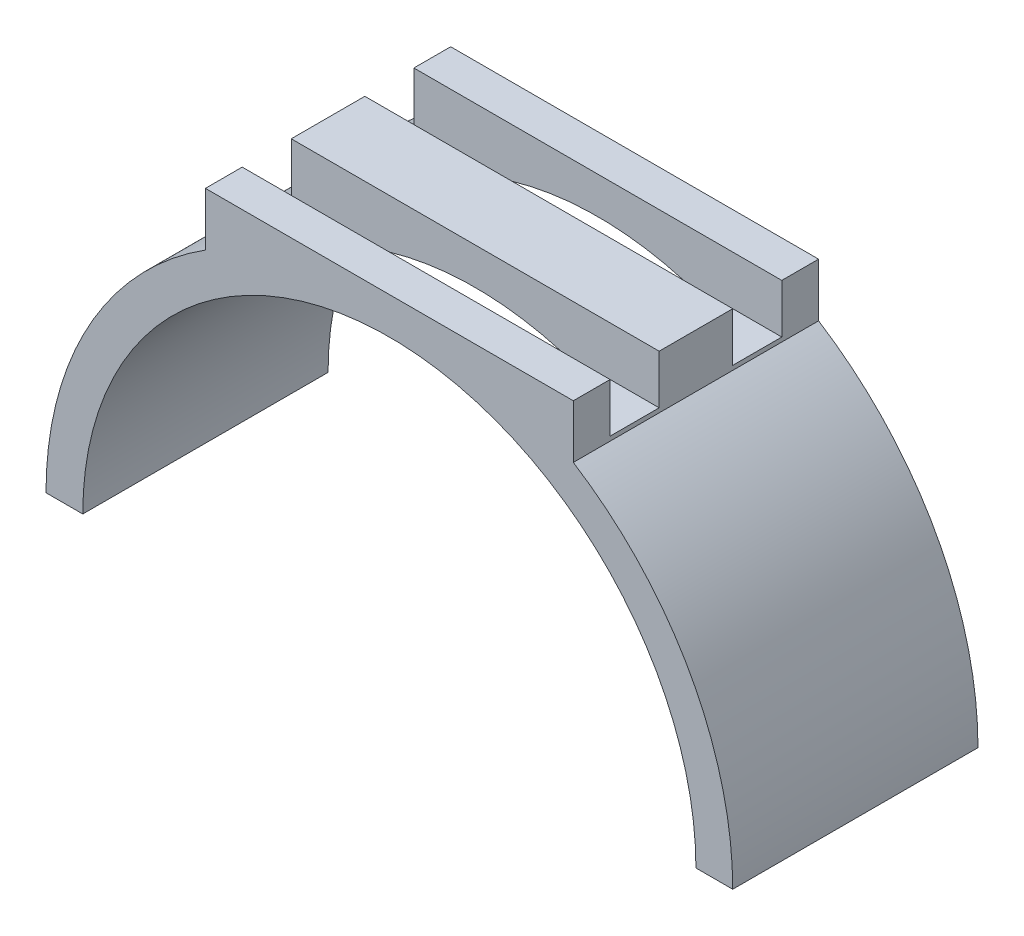
ISO-10303-21;
HEADER;
FILE_DESCRIPTION(('STEP AP214'),'2;1');
FILE_NAME('part.step','',(''),(''),'','','');
FILE_SCHEMA(('AUTOMOTIVE_DESIGN { 1 0 10303 214 1 1 1 1 }'));
ENDSEC;
DATA;
#1=APPLICATION_CONTEXT('core data for automotive mechanical design processes');
#2=APPLICATION_PROTOCOL_DEFINITION('international standard','automotive_design',2000,#1);
#3=PRODUCT_CONTEXT('',#1,'mechanical');
#4=PRODUCT('Part','Part','',(#3));
#5=PRODUCT_RELATED_PRODUCT_CATEGORY('part','',(#4));
#6=PRODUCT_DEFINITION_FORMATION('','',#4);
#7=PRODUCT_DEFINITION_CONTEXT('part definition',#1,'design');
#8=PRODUCT_DEFINITION('design','',#6,#7);
#9=PRODUCT_DEFINITION_SHAPE('','',#8);
#10=(LENGTH_UNIT() NAMED_UNIT(*) SI_UNIT(.MILLI.,.METRE.));
#11=(NAMED_UNIT(*) PLANE_ANGLE_UNIT() SI_UNIT($,.RADIAN.));
#12=(NAMED_UNIT(*) SI_UNIT($,.STERADIAN.) SOLID_ANGLE_UNIT());
#13=UNCERTAINTY_MEASURE_WITH_UNIT(LENGTH_MEASURE(1.E-05),#10,'distance_accuracy_value','');
#14=(GEOMETRIC_REPRESENTATION_CONTEXT(3) GLOBAL_UNCERTAINTY_ASSIGNED_CONTEXT((#13)) GLOBAL_UNIT_ASSIGNED_CONTEXT((#10,
#11,#12)) REPRESENTATION_CONTEXT('',''));
#15=CARTESIAN_POINT('',(0.,0.,0.));
#16=DIRECTION('',(0.,0.,1.));
#17=DIRECTION('',(1.,0.,0.));
#18=AXIS2_PLACEMENT_3D('',#15,#16,#17);
#19=CARTESIAN_POINT('',(0.,0.,20.));
#20=DIRECTION('',(0.,0.,-1.));
#21=DIRECTION('',(-1.,0.,0.));
#22=AXIS2_PLACEMENT_3D('',#19,#20,#21);
#23=CYLINDRICAL_SURFACE('',#22,25.);
#24=CARTESIAN_POINT('',(0.,0.,13.));
#25=DIRECTION('',(0.,0.,-1.));
#26=DIRECTION('',(-1.,0.,0.));
#27=AXIS2_PLACEMENT_3D('',#24,#25,#26);
#28=CIRCLE('',#27,25.);
#29=CARTESIAN_POINT('',(6.99999999999998,24.,13.));
#30=VERTEX_POINT('',#29);
#31=CARTESIAN_POINT('',(-6.99999999999999,24.,13.));
#32=VERTEX_POINT('',#31);
#33=EDGE_CURVE('E173',#30,#32,#28,.F.);
#34=ORIENTED_EDGE('',*,*,#33,.T.);
#35=DIRECTION('',(0.,0.,-1.));
#36=VECTOR('',#35,1.);
#37=CARTESIAN_POINT('',(-6.99999999999998,24.,20.));
#38=LINE('',#37,#36);
#39=CARTESIAN_POINT('',(-6.99999999999999,24.,17.));
#40=VERTEX_POINT('',#39);
#41=EDGE_CURVE('E241',#32,#40,#38,.F.);
#42=ORIENTED_EDGE('',*,*,#41,.T.);
#43=CARTESIAN_POINT('',(0.,0.,17.));
#44=DIRECTION('',(0.,0.,1.));
#45=DIRECTION('',(1.,0.,0.));
#46=AXIS2_PLACEMENT_3D('',#43,#44,#45);
#47=CIRCLE('',#46,25.);
#48=CARTESIAN_POINT('',(6.99999999999999,24.,17.));
#49=VERTEX_POINT('',#48);
#50=EDGE_CURVE('E245',#40,#49,#47,.F.);
#51=ORIENTED_EDGE('',*,*,#50,.T.);
#52=DIRECTION('',(0.,0.,-1.));
#53=VECTOR('',#52,1.);
#54=CARTESIAN_POINT('',(6.99999999999998,24.,20.));
#55=LINE('',#54,#53);
#56=EDGE_CURVE('E239',#49,#30,#55,.T.);
#57=ORIENTED_EDGE('',*,*,#56,.T.);
#58=EDGE_LOOP('',(#34,#42,#51,#57));
#59=FACE_BOUND('',#58,.T.);
#60=CARTESIAN_POINT('',(0.,0.,0.));
#61=DIRECTION('',(0.,0.,-1.));
#62=DIRECTION('',(1.,0.,0.));
#63=AXIS2_PLACEMENT_3D('',#60,#61,#62);
#64=CIRCLE('',#63,25.);
#65=CARTESIAN_POINT('',(-25.,0.,0.));
#66=VERTEX_POINT('',#65);
#67=CARTESIAN_POINT('',(25.,0.,0.));
#68=VERTEX_POINT('',#67);
#69=EDGE_CURVE('E277',#66,#68,#64,.T.);
#70=ORIENTED_EDGE('',*,*,#69,.T.);
#71=DIRECTION('',(0.,0.,-1.));
#72=VECTOR('',#71,1.);
#73=CARTESIAN_POINT('',(25.,0.,20.));
#74=LINE('',#73,#72);
#75=CARTESIAN_POINT('',(25.,0.,20.));
#76=VERTEX_POINT('',#75);
#77=EDGE_CURVE('E11',#76,#68,#74,.T.);
#78=ORIENTED_EDGE('',*,*,#77,.F.);
#79=CARTESIAN_POINT('',(0.,0.,20.));
#80=DIRECTION('',(0.,0.,-1.));
#81=DIRECTION('',(1.,0.,0.));
#82=AXIS2_PLACEMENT_3D('',#79,#80,#81);
#83=CIRCLE('',#82,25.);
#84=CARTESIAN_POINT('',(-25.,0.,20.));
#85=VERTEX_POINT('',#84);
#86=EDGE_CURVE('E278',#85,#76,#83,.T.);
#87=ORIENTED_EDGE('',*,*,#86,.F.);
#88=DIRECTION('',(0.,0.,-1.));
#89=VECTOR('',#88,1.);
#90=CARTESIAN_POINT('',(-25.,0.,20.));
#91=LINE('',#90,#89);
#92=EDGE_CURVE('E290',#85,#66,#91,.T.);
#93=ORIENTED_EDGE('',*,*,#92,.T.);
#94=EDGE_LOOP('',(#70,#78,#87,#93));
#95=FACE_BOUND('',#94,.T.);
#96=DIRECTION('',(0.,0.,-1.));
#97=VECTOR('',#96,1.);
#98=CARTESIAN_POINT('',(6.99999999999998,24.,20.));
#99=LINE('',#98,#97);
#100=CARTESIAN_POINT('',(6.99999999999999,24.,3.));
#101=VERTEX_POINT('',#100);
#102=CARTESIAN_POINT('',(6.99999999999999,24.,7.));
#103=VERTEX_POINT('',#102);
#104=EDGE_CURVE('E230',#101,#103,#99,.F.);
#105=ORIENTED_EDGE('',*,*,#104,.F.);
#106=CARTESIAN_POINT('',(0.,0.,3.));
#107=DIRECTION('',(0.,0.,-1.));
#108=DIRECTION('',(-1.,0.,0.));
#109=AXIS2_PLACEMENT_3D('',#106,#107,#108);
#110=CIRCLE('',#109,25.);
#111=CARTESIAN_POINT('',(-6.99999999999999,24.,3.));
#112=VERTEX_POINT('',#111);
#113=EDGE_CURVE('E233',#101,#112,#110,.F.);
#114=ORIENTED_EDGE('',*,*,#113,.T.);
#115=DIRECTION('',(0.,0.,-1.));
#116=VECTOR('',#115,1.);
#117=CARTESIAN_POINT('',(-6.99999999999998,24.,20.));
#118=LINE('',#117,#116);
#119=CARTESIAN_POINT('',(-6.99999999999998,24.,7.));
#120=VERTEX_POINT('',#119);
#121=EDGE_CURVE('E228',#120,#112,#118,.T.);
#122=ORIENTED_EDGE('',*,*,#121,.F.);
#123=CARTESIAN_POINT('',(0.,0.,7.));
#124=DIRECTION('',(0.,0.,1.));
#125=DIRECTION('',(1.,0.,0.));
#126=AXIS2_PLACEMENT_3D('',#123,#124,#125);
#127=CIRCLE('',#126,25.);
#128=EDGE_CURVE('E236',#120,#103,#127,.F.);
#129=ORIENTED_EDGE('',*,*,#128,.T.);
#130=EDGE_LOOP('',(#105,#114,#122,#129));
#131=FACE_BOUND('',#130,.T.);
#132=ADVANCED_FACE('F33',(#59,#95,#131),#23,.F.);
#133=CARTESIAN_POINT('',(0.,28.,0.));
#134=DIRECTION('',(0.,1.,0.));
#135=DIRECTION('',(0.,0.,1.));
#136=AXIS2_PLACEMENT_3D('',#133,#134,#135);
#137=PLANE('',#136);
#138=DIRECTION('',(1.,0.,0.));
#139=VECTOR('',#138,1.);
#140=CARTESIAN_POINT('',(15.,28.,17.));
#141=LINE('',#140,#139);
#142=CARTESIAN_POINT('',(-15.,28.,17.));
#143=VERTEX_POINT('',#142);
#144=CARTESIAN_POINT('',(15.,28.,17.));
#145=VERTEX_POINT('',#144);
#146=EDGE_CURVE('E186',#143,#145,#141,.T.);
#147=ORIENTED_EDGE('',*,*,#146,.F.);
#148=DIRECTION('',(0.,0.,1.));
#149=VECTOR('',#148,1.);
#150=CARTESIAN_POINT('',(-15.,28.,0.));
#151=LINE('',#150,#149);
#152=CARTESIAN_POINT('',(-15.,28.,20.));
#153=VERTEX_POINT('',#152);
#154=EDGE_CURVE('E256',#143,#153,#151,.T.);
#155=ORIENTED_EDGE('',*,*,#154,.T.);
#156=DIRECTION('',(-1.,0.,0.));
#157=VECTOR('',#156,1.);
#158=CARTESIAN_POINT('',(0.,28.,20.));
#159=LINE('',#158,#157);
#160=CARTESIAN_POINT('',(15.,28.,20.));
#161=VERTEX_POINT('',#160);
#162=EDGE_CURVE('E252',#161,#153,#159,.T.);
#163=ORIENTED_EDGE('',*,*,#162,.F.);
#164=DIRECTION('',(0.,0.,1.));
#165=VECTOR('',#164,1.);
#166=CARTESIAN_POINT('',(15.,28.,0.));
#167=LINE('',#166,#165);
#168=EDGE_CURVE('E267',#145,#161,#167,.T.);
#169=ORIENTED_EDGE('',*,*,#168,.F.);
#170=EDGE_LOOP('',(#147,#155,#163,#169));
#171=FACE_BOUND('',#170,.T.);
#172=ADVANCED_FACE('F369',(#171),#137,.T.);
#173=DIRECTION('',(-1.,0.,0.));
#174=VECTOR('',#173,1.);
#175=CARTESIAN_POINT('',(-15.,28.,13.));
#176=LINE('',#175,#174);
#177=CARTESIAN_POINT('',(15.,28.,13.));
#178=VERTEX_POINT('',#177);
#179=CARTESIAN_POINT('',(-15.,28.,13.));
#180=VERTEX_POINT('',#179);
#181=EDGE_CURVE('E221',#178,#180,#176,.T.);
#182=ORIENTED_EDGE('',*,*,#181,.F.);
#183=CARTESIAN_POINT('',(15.,28.,7.));
#184=VERTEX_POINT('',#183);
#185=EDGE_CURVE('E192',#184,#178,#167,.T.);
#186=ORIENTED_EDGE('',*,*,#185,.F.);
#187=DIRECTION('',(1.,0.,0.));
#188=VECTOR('',#187,1.);
#189=CARTESIAN_POINT('',(-15.,28.,7.));
#190=LINE('',#189,#188);
#191=CARTESIAN_POINT('',(-15.,28.,7.));
#192=VERTEX_POINT('',#191);
#193=EDGE_CURVE('E207',#192,#184,#190,.T.);
#194=ORIENTED_EDGE('',*,*,#193,.F.);
#195=EDGE_CURVE('E271',#192,#180,#151,.T.);
#196=ORIENTED_EDGE('',*,*,#195,.T.);
#197=EDGE_LOOP('',(#182,#186,#194,#196));
#198=FACE_BOUND('',#197,.T.);
#199=ADVANCED_FACE('F365',(#198),#137,.T.);
#200=CARTESIAN_POINT('',(0.,0.,20.));
#201=DIRECTION('',(0.,0.,-1.));
#202=DIRECTION('',(-1.,0.,0.));
#203=AXIS2_PLACEMENT_3D('',#200,#201,#202);
#204=CYLINDRICAL_SURFACE('',#203,28.);
#205=CARTESIAN_POINT('',(0.,0.,0.));
#206=DIRECTION('',(0.,0.,1.));
#207=DIRECTION('',(1.,0.,0.));
#208=AXIS2_PLACEMENT_3D('',#205,#206,#207);
#209=CIRCLE('',#208,28.);
#210=CARTESIAN_POINT('',(28.,0.,0.));
#211=VERTEX_POINT('',#210);
#212=CARTESIAN_POINT('',(15.,23.6431808350738,0.));
#213=VERTEX_POINT('',#212);
#214=EDGE_CURVE('E296',#211,#213,#209,.T.);
#215=ORIENTED_EDGE('',*,*,#214,.T.);
#216=DIRECTION('',(0.,0.,-1.));
#217=VECTOR('',#216,1.);
#218=CARTESIAN_POINT('',(15.,23.6431808350738,20.));
#219=LINE('',#218,#217);
#220=CARTESIAN_POINT('',(15.,23.6431808350738,20.));
#221=VERTEX_POINT('',#220);
#222=EDGE_CURVE('E274',#213,#221,#219,.F.);
#223=ORIENTED_EDGE('',*,*,#222,.T.);
#224=CARTESIAN_POINT('',(0.,0.,20.));
#225=DIRECTION('',(0.,0.,1.));
#226=DIRECTION('',(1.,0.,0.));
#227=AXIS2_PLACEMENT_3D('',#224,#225,#226);
#228=CIRCLE('',#227,28.);
#229=CARTESIAN_POINT('',(28.,0.,20.));
#230=VERTEX_POINT('',#229);
#231=EDGE_CURVE('E285',#230,#221,#228,.T.);
#232=ORIENTED_EDGE('',*,*,#231,.F.);
#233=DIRECTION('',(0.,0.,-1.));
#234=VECTOR('',#233,1.);
#235=CARTESIAN_POINT('',(28.,0.,20.));
#236=LINE('',#235,#234);
#237=EDGE_CURVE('E40',#230,#211,#236,.T.);
#238=ORIENTED_EDGE('',*,*,#237,.T.);
#239=EDGE_LOOP('',(#215,#223,#232,#238));
#240=FACE_BOUND('',#239,.T.);
#241=ADVANCED_FACE('F309',(#240),#204,.T.);
#242=CARTESIAN_POINT('',(25.,0.,20.));
#243=DIRECTION('',(0.,1.,0.));
#244=DIRECTION('',(0.,0.,1.));
#245=AXIS2_PLACEMENT_3D('',#242,#243,#244);
#246=PLANE('',#245);
#247=DIRECTION('',(1.,0.,0.));
#248=VECTOR('',#247,1.);
#249=CARTESIAN_POINT('',(25.,0.,0.));
#250=LINE('',#249,#248);
#251=EDGE_CURVE('E293',#68,#211,#250,.T.);
#252=ORIENTED_EDGE('',*,*,#251,.T.);
#253=ORIENTED_EDGE('',*,*,#237,.F.);
#254=DIRECTION('',(1.,0.,0.));
#255=VECTOR('',#254,1.);
#256=CARTESIAN_POINT('',(25.,0.,20.));
#257=LINE('',#256,#255);
#258=EDGE_CURVE('E281',#76,#230,#257,.T.);
#259=ORIENTED_EDGE('',*,*,#258,.F.);
#260=ORIENTED_EDGE('',*,*,#77,.T.);
#261=EDGE_LOOP('',(#252,#253,#259,#260));
#262=FACE_BOUND('',#261,.T.);
#263=ADVANCED_FACE('F324',(#262),#246,.F.);
#264=CARTESIAN_POINT('',(-15.,23.6431808350738,20.));
#265=VERTEX_POINT('',#264);
#266=CARTESIAN_POINT('',(-28.,0.,20.));
#267=VERTEX_POINT('',#266);
#268=EDGE_CURVE('E284',#265,#267,#228,.T.);
#269=ORIENTED_EDGE('',*,*,#268,.F.);
#270=DIRECTION('',(0.,0.,-1.));
#271=VECTOR('',#270,1.);
#272=CARTESIAN_POINT('',(-15.,23.6431808350738,20.));
#273=LINE('',#272,#271);
#274=CARTESIAN_POINT('',(-15.,23.6431808350738,0.));
#275=VERTEX_POINT('',#274);
#276=EDGE_CURVE('E266',#265,#275,#273,.T.);
#277=ORIENTED_EDGE('',*,*,#276,.T.);
#278=CARTESIAN_POINT('',(-28.,0.,0.));
#279=VERTEX_POINT('',#278);
#280=EDGE_CURVE('E295',#275,#279,#209,.T.);
#281=ORIENTED_EDGE('',*,*,#280,.T.);
#282=DIRECTION('',(0.,0.,-1.));
#283=VECTOR('',#282,1.);
#284=CARTESIAN_POINT('',(-28.,0.,20.));
#285=LINE('',#284,#283);
#286=EDGE_CURVE('E302',#267,#279,#285,.T.);
#287=ORIENTED_EDGE('',*,*,#286,.F.);
#288=EDGE_LOOP('',(#269,#277,#281,#287));
#289=FACE_BOUND('',#288,.T.);
#290=ADVANCED_FACE('F336',(#289),#204,.T.);
#291=CARTESIAN_POINT('',(-28.,0.,20.));
#292=DIRECTION('',(0.,1.,0.));
#293=DIRECTION('',(0.,0.,1.));
#294=AXIS2_PLACEMENT_3D('',#291,#292,#293);
#295=PLANE('',#294);
#296=DIRECTION('',(1.,0.,0.));
#297=VECTOR('',#296,1.);
#298=CARTESIAN_POINT('',(-28.,0.,0.));
#299=LINE('',#298,#297);
#300=EDGE_CURVE('E282',#279,#66,#299,.T.);
#301=ORIENTED_EDGE('',*,*,#300,.T.);
#302=ORIENTED_EDGE('',*,*,#92,.F.);
#303=DIRECTION('',(1.,0.,0.));
#304=VECTOR('',#303,1.);
#305=CARTESIAN_POINT('',(-28.,0.,20.));
#306=LINE('',#305,#304);
#307=EDGE_CURVE('E288',#267,#85,#306,.T.);
#308=ORIENTED_EDGE('',*,*,#307,.F.);
#309=ORIENTED_EDGE('',*,*,#286,.T.);
#310=EDGE_LOOP('',(#301,#302,#308,#309));
#311=FACE_BOUND('',#310,.T.);
#312=ADVANCED_FACE('F331',(#311),#295,.F.);
#313=CARTESIAN_POINT('',(0.,0.,20.));
#314=DIRECTION('',(0.,0.,1.));
#315=DIRECTION('',(1.,0.,0.));
#316=AXIS2_PLACEMENT_3D('',#313,#314,#315);
#317=PLANE('',#316);
#318=ORIENTED_EDGE('',*,*,#231,.T.);
#319=DIRECTION('',(0.,1.,0.));
#320=VECTOR('',#319,1.);
#321=CARTESIAN_POINT('',(15.,28.,20.));
#322=LINE('',#321,#320);
#323=EDGE_CURVE('E258',#221,#161,#322,.T.);
#324=ORIENTED_EDGE('',*,*,#323,.T.);
#325=ORIENTED_EDGE('',*,*,#162,.T.);
#326=DIRECTION('',(0.,-1.,0.));
#327=VECTOR('',#326,1.);
#328=CARTESIAN_POINT('',(-15.,28.,20.));
#329=LINE('',#328,#327);
#330=EDGE_CURVE('E248',#153,#265,#329,.T.);
#331=ORIENTED_EDGE('',*,*,#330,.T.);
#332=ORIENTED_EDGE('',*,*,#268,.T.);
#333=ORIENTED_EDGE('',*,*,#307,.T.);
#334=ORIENTED_EDGE('',*,*,#86,.T.);
#335=ORIENTED_EDGE('',*,*,#258,.T.);
#336=EDGE_LOOP('',(#318,#324,#325,#331,#332,#333,#334,#335));
#337=FACE_BOUND('',#336,.T.);
#338=ADVANCED_FACE('F320',(#337),#317,.T.);
#339=CARTESIAN_POINT('',(0.,0.,0.));
#340=DIRECTION('',(0.,0.,1.));
#341=DIRECTION('',(1.,0.,0.));
#342=AXIS2_PLACEMENT_3D('',#339,#340,#341);
#343=PLANE('',#342);
#344=DIRECTION('',(0.,-1.,0.));
#345=VECTOR('',#344,1.);
#346=CARTESIAN_POINT('',(-15.,28.,0.));
#347=LINE('',#346,#345);
#348=CARTESIAN_POINT('',(-15.,28.,0.));
#349=VERTEX_POINT('',#348);
#350=EDGE_CURVE('E251',#349,#275,#347,.T.);
#351=ORIENTED_EDGE('',*,*,#350,.F.);
#352=DIRECTION('',(-1.,0.,0.));
#353=VECTOR('',#352,1.);
#354=CARTESIAN_POINT('',(0.,28.,0.));
#355=LINE('',#354,#353);
#356=CARTESIAN_POINT('',(15.,28.,0.));
#357=VERTEX_POINT('',#356);
#358=EDGE_CURVE('E249',#357,#349,#355,.T.);
#359=ORIENTED_EDGE('',*,*,#358,.F.);
#360=DIRECTION('',(0.,1.,0.));
#361=VECTOR('',#360,1.);
#362=CARTESIAN_POINT('',(15.,28.,0.));
#363=LINE('',#362,#361);
#364=EDGE_CURVE('E254',#213,#357,#363,.T.);
#365=ORIENTED_EDGE('',*,*,#364,.F.);
#366=ORIENTED_EDGE('',*,*,#214,.F.);
#367=ORIENTED_EDGE('',*,*,#251,.F.);
#368=ORIENTED_EDGE('',*,*,#69,.F.);
#369=ORIENTED_EDGE('',*,*,#300,.F.);
#370=ORIENTED_EDGE('',*,*,#280,.F.);
#371=EDGE_LOOP('',(#351,#359,#365,#366,#367,#368,#369,#370));
#372=FACE_BOUND('',#371,.T.);
#373=ADVANCED_FACE('F314',(#372),#343,.F.);
#374=DIRECTION('',(-1.,0.,0.));
#375=VECTOR('',#374,1.);
#376=CARTESIAN_POINT('',(15.,28.,3.));
#377=LINE('',#376,#375);
#378=CARTESIAN_POINT('',(15.,28.,3.));
#379=VERTEX_POINT('',#378);
#380=CARTESIAN_POINT('',(-15.,28.,3.));
#381=VERTEX_POINT('',#380);
#382=EDGE_CURVE('E216',#379,#381,#377,.T.);
#383=ORIENTED_EDGE('',*,*,#382,.F.);
#384=EDGE_CURVE('E263',#357,#379,#167,.T.);
#385=ORIENTED_EDGE('',*,*,#384,.F.);
#386=ORIENTED_EDGE('',*,*,#358,.T.);
#387=EDGE_CURVE('E268',#349,#381,#151,.T.);
#388=ORIENTED_EDGE('',*,*,#387,.T.);
#389=EDGE_LOOP('',(#383,#385,#386,#388));
#390=FACE_BOUND('',#389,.T.);
#391=ADVANCED_FACE('F347',(#390),#137,.T.);
#392=CARTESIAN_POINT('',(15.,28.,0.));
#393=DIRECTION('',(1.,0.,0.));
#394=DIRECTION('',(0.,0.,-1.));
#395=AXIS2_PLACEMENT_3D('',#392,#393,#394);
#396=PLANE('',#395);
#397=DIRECTION('',(0.,1.,0.));
#398=VECTOR('',#397,1.);
#399=CARTESIAN_POINT('',(15.,24.,17.));
#400=LINE('',#399,#398);
#401=CARTESIAN_POINT('',(15.,24.,17.));
#402=VERTEX_POINT('',#401);
#403=EDGE_CURVE('E231',#402,#145,#400,.T.);
#404=ORIENTED_EDGE('',*,*,#403,.T.);
#405=ORIENTED_EDGE('',*,*,#168,.T.);
#406=ORIENTED_EDGE('',*,*,#323,.F.);
#407=ORIENTED_EDGE('',*,*,#222,.F.);
#408=ORIENTED_EDGE('',*,*,#364,.T.);
#409=ORIENTED_EDGE('',*,*,#384,.T.);
#410=DIRECTION('',(0.,1.,0.));
#411=VECTOR('',#410,1.);
#412=CARTESIAN_POINT('',(15.,24.,3.));
#413=LINE('',#412,#411);
#414=CARTESIAN_POINT('',(15.,24.,3.));
#415=VERTEX_POINT('',#414);
#416=EDGE_CURVE('E215',#415,#379,#413,.T.);
#417=ORIENTED_EDGE('',*,*,#416,.F.);
#418=DIRECTION('',(0.,0.,-1.));
#419=VECTOR('',#418,1.);
#420=CARTESIAN_POINT('',(15.,24.,7.));
#421=LINE('',#420,#419);
#422=CARTESIAN_POINT('',(15.,24.,7.));
#423=VERTEX_POINT('',#422);
#424=EDGE_CURVE('E203',#423,#415,#421,.T.);
#425=ORIENTED_EDGE('',*,*,#424,.F.);
#426=DIRECTION('',(0.,1.,0.));
#427=VECTOR('',#426,1.);
#428=CARTESIAN_POINT('',(15.,24.,7.));
#429=LINE('',#428,#427);
#430=EDGE_CURVE('E219',#423,#184,#429,.T.);
#431=ORIENTED_EDGE('',*,*,#430,.T.);
#432=ORIENTED_EDGE('',*,*,#185,.T.);
#433=DIRECTION('',(0.,1.,0.));
#434=VECTOR('',#433,1.);
#435=CARTESIAN_POINT('',(15.,24.,13.));
#436=LINE('',#435,#434);
#437=CARTESIAN_POINT('',(15.,24.,13.));
#438=VERTEX_POINT('',#437);
#439=EDGE_CURVE('E169',#438,#178,#436,.T.);
#440=ORIENTED_EDGE('',*,*,#439,.F.);
#441=DIRECTION('',(0.,0.,-1.));
#442=VECTOR('',#441,1.);
#443=CARTESIAN_POINT('',(15.,24.,13.));
#444=LINE('',#443,#442);
#445=EDGE_CURVE('E179',#402,#438,#444,.T.);
#446=ORIENTED_EDGE('',*,*,#445,.F.);
#447=EDGE_LOOP('',(#404,#405,#406,#407,#408,#409,#417,#425,#431,#432,#440,#446));
#448=FACE_BOUND('',#447,.T.);
#449=ADVANCED_FACE('F189',(#448),#396,.T.);
#450=CARTESIAN_POINT('',(-15.,28.,0.));
#451=DIRECTION('',(-1.,0.,0.));
#452=DIRECTION('',(0.,0.,1.));
#453=AXIS2_PLACEMENT_3D('',#450,#451,#452);
#454=PLANE('',#453);
#455=DIRECTION('',(0.,1.,0.));
#456=VECTOR('',#455,1.);
#457=CARTESIAN_POINT('',(-15.,24.,17.));
#458=LINE('',#457,#456);
#459=CARTESIAN_POINT('',(-15.,24.,17.));
#460=VERTEX_POINT('',#459);
#461=EDGE_CURVE('E197',#460,#143,#458,.T.);
#462=ORIENTED_EDGE('',*,*,#461,.F.);
#463=DIRECTION('',(0.,0.,1.));
#464=VECTOR('',#463,1.);
#465=CARTESIAN_POINT('',(-15.,24.,17.));
#466=LINE('',#465,#464);
#467=CARTESIAN_POINT('',(-15.,24.,13.));
#468=VERTEX_POINT('',#467);
#469=EDGE_CURVE('E175',#468,#460,#466,.T.);
#470=ORIENTED_EDGE('',*,*,#469,.F.);
#471=DIRECTION('',(0.,1.,0.));
#472=VECTOR('',#471,1.);
#473=CARTESIAN_POINT('',(-15.,24.,13.));
#474=LINE('',#473,#472);
#475=EDGE_CURVE('E193',#468,#180,#474,.T.);
#476=ORIENTED_EDGE('',*,*,#475,.T.);
#477=ORIENTED_EDGE('',*,*,#195,.F.);
#478=DIRECTION('',(0.,1.,0.));
#479=VECTOR('',#478,1.);
#480=CARTESIAN_POINT('',(-15.,24.,7.));
#481=LINE('',#480,#479);
#482=CARTESIAN_POINT('',(-15.,24.,7.));
#483=VERTEX_POINT('',#482);
#484=EDGE_CURVE('E222',#483,#192,#481,.T.);
#485=ORIENTED_EDGE('',*,*,#484,.F.);
#486=DIRECTION('',(0.,0.,1.));
#487=VECTOR('',#486,1.);
#488=CARTESIAN_POINT('',(-15.,24.,3.));
#489=LINE('',#488,#487);
#490=CARTESIAN_POINT('',(-15.,24.,3.));
#491=VERTEX_POINT('',#490);
#492=EDGE_CURVE('E211',#491,#483,#489,.T.);
#493=ORIENTED_EDGE('',*,*,#492,.F.);
#494=DIRECTION('',(0.,1.,0.));
#495=VECTOR('',#494,1.);
#496=CARTESIAN_POINT('',(-15.,24.,3.));
#497=LINE('',#496,#495);
#498=EDGE_CURVE('E224',#491,#381,#497,.T.);
#499=ORIENTED_EDGE('',*,*,#498,.T.);
#500=ORIENTED_EDGE('',*,*,#387,.F.);
#501=ORIENTED_EDGE('',*,*,#350,.T.);
#502=ORIENTED_EDGE('',*,*,#276,.F.);
#503=ORIENTED_EDGE('',*,*,#330,.F.);
#504=ORIENTED_EDGE('',*,*,#154,.F.);
#505=EDGE_LOOP('',(#462,#470,#476,#477,#485,#493,#499,#500,#501,#502,#503,#504));
#506=FACE_BOUND('',#505,.T.);
#507=ADVANCED_FACE('F341',(#506),#454,.T.);
#508=CARTESIAN_POINT('',(-15.,24.,7.));
#509=DIRECTION('',(0.,0.,1.));
#510=DIRECTION('',(1.,0.,0.));
#511=AXIS2_PLACEMENT_3D('',#508,#509,#510);
#512=PLANE('',#511);
#513=DIRECTION('',(1.,0.,0.));
#514=VECTOR('',#513,1.);
#515=CARTESIAN_POINT('',(-15.,24.,7.));
#516=LINE('',#515,#514);
#517=EDGE_CURVE('E55',#483,#120,#516,.T.);
#518=ORIENTED_EDGE('',*,*,#517,.F.);
#519=ORIENTED_EDGE('',*,*,#484,.T.);
#520=ORIENTED_EDGE('',*,*,#193,.T.);
#521=ORIENTED_EDGE('',*,*,#430,.F.);
#522=EDGE_CURVE('E213',#103,#423,#516,.T.);
#523=ORIENTED_EDGE('',*,*,#522,.F.);
#524=ORIENTED_EDGE('',*,*,#128,.F.);
#525=EDGE_LOOP('',(#518,#519,#520,#521,#523,#524));
#526=FACE_BOUND('',#525,.T.);
#527=ADVANCED_FACE('F359',(#526),#512,.F.);
#528=CARTESIAN_POINT('',(15.,24.,3.));
#529=DIRECTION('',(0.,0.,-1.));
#530=DIRECTION('',(-1.,0.,0.));
#531=AXIS2_PLACEMENT_3D('',#528,#529,#530);
#532=PLANE('',#531);
#533=DIRECTION('',(-1.,0.,0.));
#534=VECTOR('',#533,1.);
#535=CARTESIAN_POINT('',(15.,24.,3.));
#536=LINE('',#535,#534);
#537=EDGE_CURVE('E208',#415,#101,#536,.T.);
#538=ORIENTED_EDGE('',*,*,#537,.F.);
#539=ORIENTED_EDGE('',*,*,#416,.T.);
#540=ORIENTED_EDGE('',*,*,#382,.T.);
#541=ORIENTED_EDGE('',*,*,#498,.F.);
#542=EDGE_CURVE('E206',#112,#491,#536,.T.);
#543=ORIENTED_EDGE('',*,*,#542,.F.);
#544=ORIENTED_EDGE('',*,*,#113,.F.);
#545=EDGE_LOOP('',(#538,#539,#540,#541,#543,#544));
#546=FACE_BOUND('',#545,.T.);
#547=ADVANCED_FACE('F349',(#546),#532,.F.);
#548=CARTESIAN_POINT('',(0.,24.,0.));
#549=DIRECTION('',(0.,1.,0.));
#550=DIRECTION('',(0.,0.,1.));
#551=AXIS2_PLACEMENT_3D('',#548,#549,#550);
#552=PLANE('',#551);
#553=ORIENTED_EDGE('',*,*,#104,.T.);
#554=ORIENTED_EDGE('',*,*,#522,.T.);
#555=ORIENTED_EDGE('',*,*,#424,.T.);
#556=ORIENTED_EDGE('',*,*,#537,.T.);
#557=EDGE_LOOP('',(#553,#554,#555,#556));
#558=FACE_BOUND('',#557,.T.);
#559=ADVANCED_FACE('F355',(#558),#552,.T.);
#560=ORIENTED_EDGE('',*,*,#121,.T.);
#561=ORIENTED_EDGE('',*,*,#542,.T.);
#562=ORIENTED_EDGE('',*,*,#492,.T.);
#563=ORIENTED_EDGE('',*,*,#517,.T.);
#564=EDGE_LOOP('',(#560,#561,#562,#563));
#565=FACE_BOUND('',#564,.T.);
#566=ADVANCED_FACE('F466',(#565),#552,.T.);
#567=CARTESIAN_POINT('',(15.,24.,17.));
#568=DIRECTION('',(0.,0.,1.));
#569=DIRECTION('',(1.,0.,0.));
#570=AXIS2_PLACEMENT_3D('',#567,#568,#569);
#571=PLANE('',#570);
#572=DIRECTION('',(1.,0.,0.));
#573=VECTOR('',#572,1.);
#574=CARTESIAN_POINT('',(15.,24.,17.));
#575=LINE('',#574,#573);
#576=EDGE_CURVE('E194',#460,#40,#575,.T.);
#577=ORIENTED_EDGE('',*,*,#576,.F.);
#578=ORIENTED_EDGE('',*,*,#461,.T.);
#579=ORIENTED_EDGE('',*,*,#146,.T.);
#580=ORIENTED_EDGE('',*,*,#403,.F.);
#581=EDGE_CURVE('E182',#49,#402,#575,.T.);
#582=ORIENTED_EDGE('',*,*,#581,.F.);
#583=ORIENTED_EDGE('',*,*,#50,.F.);
#584=EDGE_LOOP('',(#577,#578,#579,#580,#582,#583));
#585=FACE_BOUND('',#584,.T.);
#586=ADVANCED_FACE('F380',(#585),#571,.F.);
#587=CARTESIAN_POINT('',(-15.,24.,13.));
#588=DIRECTION('',(0.,0.,-1.));
#589=DIRECTION('',(-1.,0.,0.));
#590=AXIS2_PLACEMENT_3D('',#587,#588,#589);
#591=PLANE('',#590);
#592=DIRECTION('',(-1.,0.,0.));
#593=VECTOR('',#592,1.);
#594=CARTESIAN_POINT('',(-15.,24.,13.));
#595=LINE('',#594,#593);
#596=EDGE_CURVE('E47',#438,#30,#595,.T.);
#597=ORIENTED_EDGE('',*,*,#596,.F.);
#598=ORIENTED_EDGE('',*,*,#439,.T.);
#599=ORIENTED_EDGE('',*,*,#181,.T.);
#600=ORIENTED_EDGE('',*,*,#475,.F.);
#601=EDGE_CURVE('E176',#32,#468,#595,.T.);
#602=ORIENTED_EDGE('',*,*,#601,.F.);
#603=ORIENTED_EDGE('',*,*,#33,.F.);
#604=EDGE_LOOP('',(#597,#598,#599,#600,#602,#603));
#605=FACE_BOUND('',#604,.T.);
#606=ADVANCED_FACE('F167',(#605),#591,.F.);
#607=CARTESIAN_POINT('',(0.,24.,0.));
#608=DIRECTION('',(0.,-1.,0.));
#609=DIRECTION('',(0.,0.,-1.));
#610=AXIS2_PLACEMENT_3D('',#607,#608,#609);
#611=PLANE('',#610);
#612=ORIENTED_EDGE('',*,*,#601,.T.);
#613=ORIENTED_EDGE('',*,*,#469,.T.);
#614=ORIENTED_EDGE('',*,*,#576,.T.);
#615=ORIENTED_EDGE('',*,*,#41,.F.);
#616=EDGE_LOOP('',(#612,#613,#614,#615));
#617=FACE_BOUND('',#616,.T.);
#618=ADVANCED_FACE('F379',(#617),#611,.F.);
#619=ORIENTED_EDGE('',*,*,#581,.T.);
#620=ORIENTED_EDGE('',*,*,#445,.T.);
#621=ORIENTED_EDGE('',*,*,#596,.T.);
#622=ORIENTED_EDGE('',*,*,#56,.F.);
#623=EDGE_LOOP('',(#619,#620,#621,#622));
#624=FACE_BOUND('',#623,.T.);
#625=ADVANCED_FACE('F180',(#624),#611,.F.);
#626=CLOSED_SHELL('',(#132,#172,#199,#241,#263,#290,#312,#338,#373,#391,#449,#507,#527,#547,
#559,#566,#586,#606,#618,#625));
#627=MANIFOLD_SOLID_BREP('B2',#626);
#628=ADVANCED_BREP_SHAPE_REPRESENTATION('',(#18,#627),#14);
#629=SHAPE_DEFINITION_REPRESENTATION(#9,#628);
ENDSEC;
END-ISO-10303-21;
